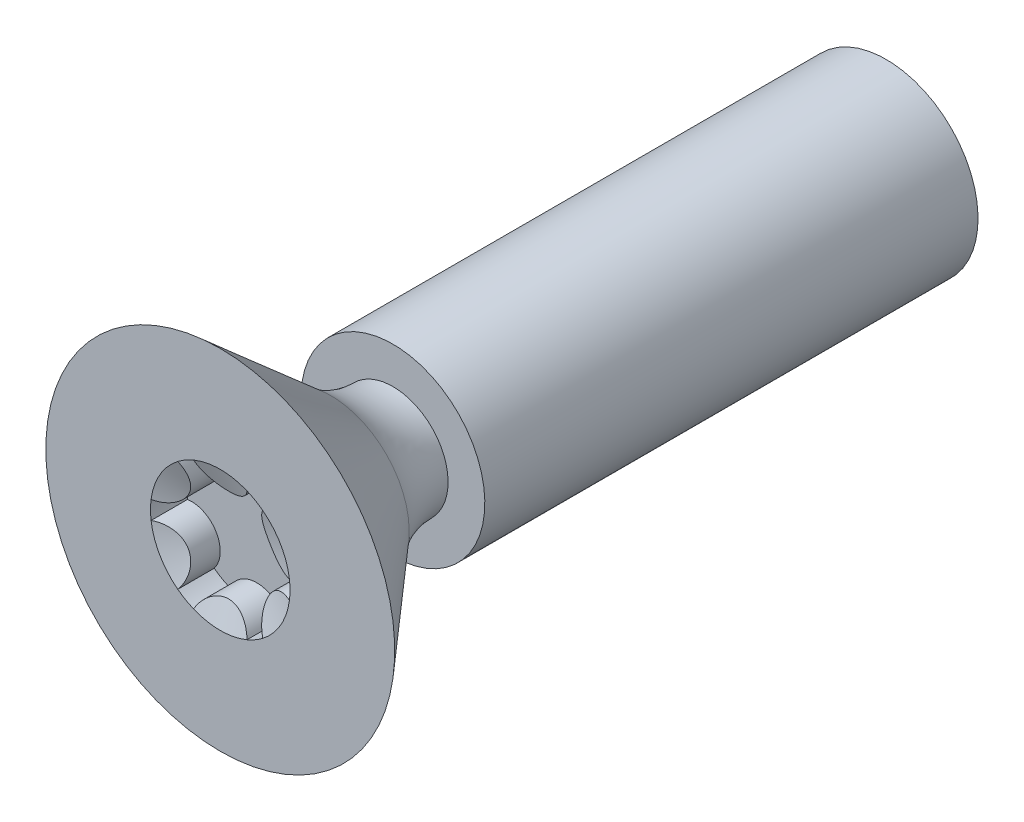
ISO-10303-21;
HEADER;
FILE_DESCRIPTION(('STEP AP214'),'2;1');
FILE_NAME('part.step','',(''),(''),'','','');
FILE_SCHEMA(('AUTOMOTIVE_DESIGN { 1 0 10303 214 1 1 1 1 }'));
ENDSEC;
DATA;
#1=APPLICATION_CONTEXT('core data for automotive mechanical design processes');
#2=APPLICATION_PROTOCOL_DEFINITION('international standard','automotive_design',2000,#1);
#3=PRODUCT_CONTEXT('',#1,'mechanical');
#4=PRODUCT('Part','Part','',(#3));
#5=PRODUCT_RELATED_PRODUCT_CATEGORY('part','',(#4));
#6=PRODUCT_DEFINITION_FORMATION('','',#4);
#7=PRODUCT_DEFINITION_CONTEXT('part definition',#1,'design');
#8=PRODUCT_DEFINITION('design','',#6,#7);
#9=PRODUCT_DEFINITION_SHAPE('','',#8);
#10=(LENGTH_UNIT() NAMED_UNIT(*) SI_UNIT(.MILLI.,.METRE.));
#11=(NAMED_UNIT(*) PLANE_ANGLE_UNIT() SI_UNIT($,.RADIAN.));
#12=(NAMED_UNIT(*) SI_UNIT($,.STERADIAN.) SOLID_ANGLE_UNIT());
#13=UNCERTAINTY_MEASURE_WITH_UNIT(LENGTH_MEASURE(1.E-05),#10,'distance_accuracy_value','');
#14=(GEOMETRIC_REPRESENTATION_CONTEXT(3) GLOBAL_UNCERTAINTY_ASSIGNED_CONTEXT((#13)) GLOBAL_UNIT_ASSIGNED_CONTEXT((#10,
#11,#12)) REPRESENTATION_CONTEXT('',''));
#15=CARTESIAN_POINT('',(0.,0.,0.));
#16=DIRECTION('',(0.,0.,1.));
#17=DIRECTION('',(1.,0.,0.));
#18=AXIS2_PLACEMENT_3D('',#15,#16,#17);
#19=CARTESIAN_POINT('',(0.,0.,-6.35));
#20=DIRECTION('',(0.,0.,1.));
#21=DIRECTION('',(0.,-1.,0.));
#22=AXIS2_PLACEMENT_3D('',#19,#20,#21);
#23=PLANE('',#22);
#24=CARTESIAN_POINT('',(0.,0.,-6.35));
#25=DIRECTION('',(0.,0.,1.));
#26=DIRECTION('',(0.,-1.,0.));
#27=AXIS2_PLACEMENT_3D('',#24,#25,#26);
#28=CIRCLE('',#27,1.75260000000001);
#29=CARTESIAN_POINT('',(0.,-1.75260000000001,-6.35));
#30=VERTEX_POINT('',#29);
#31=EDGE_CURVE('E53',#30,#30,#28,.T.);
#32=ORIENTED_EDGE('',*,*,#31,.F.);
#33=EDGE_LOOP('',(#32));
#34=FACE_BOUND('',#33,.T.);
#35=ADVANCED_FACE('F39',(#34),#23,.F.);
#36=CARTESIAN_POINT('',(0.,0.,6.35));
#37=DIRECTION('',(0.,0.,1.));
#38=DIRECTION('',(0.,-1.,0.));
#39=AXIS2_PLACEMENT_3D('',#36,#37,#38);
#40=CYLINDRICAL_SURFACE('',#39,1.75260000000001);
#41=CARTESIAN_POINT('',(0.,0.,3.05638181183952));
#42=DIRECTION('',(0.,0.,1.));
#43=DIRECTION('',(0.,-1.,0.));
#44=AXIS2_PLACEMENT_3D('',#41,#42,#43);
#45=CIRCLE('',#44,1.7526);
#46=CARTESIAN_POINT('',(0.,-1.75260000000001,3.05638181183952));
#47=VERTEX_POINT('',#46);
#48=EDGE_CURVE('E201',#47,#47,#45,.T.);
#49=ORIENTED_EDGE('',*,*,#48,.F.);
#50=EDGE_LOOP('',(#49));
#51=FACE_BOUND('',#50,.T.);
#52=ORIENTED_EDGE('',*,*,#31,.T.);
#53=EDGE_LOOP('',(#52));
#54=FACE_BOUND('',#53,.T.);
#55=ADVANCED_FACE('F206',(#51,#54),#40,.T.);
#56=CARTESIAN_POINT('',(0.,1.7526,3.05638181183952));
#57=DIRECTION('',(0.,0.,-1.));
#58=DIRECTION('',(0.,1.,0.));
#59=AXIS2_PLACEMENT_3D('',#56,#57,#58);
#60=PLANE('',#59);
#61=CARTESIAN_POINT('',(0.,0.,3.05638181183953));
#62=DIRECTION('',(0.,0.,1.));
#63=DIRECTION('',(0.,-1.,0.));
#64=AXIS2_PLACEMENT_3D('',#61,#62,#63);
#65=CIRCLE('',#64,1.05156000000001);
#66=CARTESIAN_POINT('',(0.,-1.05156000000001,3.05638181183953));
#67=VERTEX_POINT('',#66);
#68=EDGE_CURVE('E198',#67,#67,#65,.T.);
#69=ORIENTED_EDGE('',*,*,#68,.F.);
#70=EDGE_LOOP('',(#69));
#71=FACE_BOUND('',#70,.T.);
#72=ORIENTED_EDGE('',*,*,#48,.T.);
#73=EDGE_LOOP('',(#72));
#74=FACE_BOUND('',#73,.T.);
#75=ADVANCED_FACE('F212',(#71,#74),#60,.F.);
#76=CARTESIAN_POINT('',(0.,0.,3.05638181183952));
#77=DIRECTION('',(0.,0.,1.));
#78=DIRECTION('',(0.,-1.,0.));
#79=AXIS2_PLACEMENT_3D('',#76,#77,#78);
#80=TOROIDAL_SURFACE('',#79,2.85843733234083,1.80687733234082);
#81=CARTESIAN_POINT('',(0.,0.,4.2418));
#82=DIRECTION('',(0.,0.,1.));
#83=DIRECTION('',(0.,-1.,0.));
#84=AXIS2_PLACEMENT_3D('',#81,#82,#83);
#85=CIRCLE('',#84,1.49476969933584);
#86=CARTESIAN_POINT('',(0.,-1.49476969933585,4.2418));
#87=VERTEX_POINT('',#86);
#88=EDGE_CURVE('E195',#87,#87,#85,.T.);
#89=ORIENTED_EDGE('',*,*,#88,.F.);
#90=EDGE_LOOP('',(#89));
#91=FACE_BOUND('',#90,.T.);
#92=ORIENTED_EDGE('',*,*,#68,.T.);
#93=EDGE_LOOP('',(#92));
#94=FACE_BOUND('',#93,.T.);
#95=ADVANCED_FACE('F217',(#91,#94),#80,.F.);
#96=CARTESIAN_POINT('',(0.,0.,4.2418));
#97=DIRECTION('',(0.,0.,1.));
#98=DIRECTION('',(0.,-1.,0.));
#99=AXIS2_PLACEMENT_3D('',#96,#97,#98);
#100=CONICAL_SURFACE('',#99,1.49476969933584,0.715584993317673);
#101=CARTESIAN_POINT('',(0.,0.,6.35));
#102=DIRECTION('',(0.,0.,1.));
#103=DIRECTION('',(0.,-1.,0.));
#104=AXIS2_PLACEMENT_3D('',#101,#102,#103);
#105=CIRCLE('',#104,3.32740000000001);
#106=CARTESIAN_POINT('',(0.,-3.32740000000001,6.35));
#107=VERTEX_POINT('',#106);
#108=EDGE_CURVE('E190',#107,#107,#105,.T.);
#109=ORIENTED_EDGE('',*,*,#108,.F.);
#110=EDGE_LOOP('',(#109));
#111=FACE_BOUND('',#110,.T.);
#112=ORIENTED_EDGE('',*,*,#88,.T.);
#113=EDGE_LOOP('',(#112));
#114=FACE_BOUND('',#113,.T.);
#115=ADVANCED_FACE('F224',(#111,#114),#100,.T.);
#116=CARTESIAN_POINT('',(0.,3.3274,6.35));
#117=DIRECTION('',(0.,0.,-1.));
#118=DIRECTION('',(0.,1.,0.));
#119=AXIS2_PLACEMENT_3D('',#116,#117,#118);
#120=PLANE('',#119);
#121=CARTESIAN_POINT('',(0.,0.,6.35));
#122=DIRECTION('',(0.,0.,1.));
#123=DIRECTION('',(1.,0.,0.));
#124=AXIS2_PLACEMENT_3D('',#121,#122,#123);
#125=CIRCLE('',#124,1.33096);
#126=CARTESIAN_POINT('',(0.810237111553449,1.05592156179402,6.35));
#127=VERTEX_POINT('',#126);
#128=CARTESIAN_POINT('',(0.50933634114064,1.22964670259122,6.35));
#129=VERTEX_POINT('',#128);
#130=EDGE_CURVE('E149',#127,#129,#125,.T.);
#131=ORIENTED_EDGE('',*,*,#130,.F.);
#132=CARTESIAN_POINT('',(0.,0.,6.35));
#133=DIRECTION('',(0.,0.,1.));
#134=DIRECTION('',(1.,0.,0.));
#135=AXIS2_PLACEMENT_3D('',#132,#133,#134);
#136=CIRCLE('',#135,1.33096);
#137=CARTESIAN_POINT('',(1.31957345269409,0.173725140797197,6.35));
#138=VERTEX_POINT('',#137);
#139=EDGE_CURVE('E132',#138,#127,#136,.T.);
#140=ORIENTED_EDGE('',*,*,#139,.F.);
#141=CARTESIAN_POINT('',(0.,0.,6.35));
#142=DIRECTION('',(0.,0.,1.));
#143=DIRECTION('',(0.499999999999998,-0.86602540378444,0.));
#144=AXIS2_PLACEMENT_3D('',#141,#142,#143);
#145=CIRCLE('',#144,1.33096);
#146=CARTESIAN_POINT('',(1.31957345269409,-0.173725140797205,6.35));
#147=VERTEX_POINT('',#146);
#148=EDGE_CURVE('E146',#147,#138,#145,.T.);
#149=ORIENTED_EDGE('',*,*,#148,.F.);
#150=CARTESIAN_POINT('',(0.810237111553442,-1.05592156179403,6.35));
#151=VERTEX_POINT('',#150);
#152=EDGE_CURVE('E154',#151,#147,#136,.T.);
#153=ORIENTED_EDGE('',*,*,#152,.F.);
#154=CARTESIAN_POINT('',(0.,0.,6.35));
#155=DIRECTION('',(0.,0.,1.));
#156=DIRECTION('',(-0.500000000000004,-0.866025403784436,0.));
#157=AXIS2_PLACEMENT_3D('',#154,#155,#156);
#158=CIRCLE('',#157,1.33096);
#159=CARTESIAN_POINT('',(0.509336341140641,-1.22964670259122,6.35));
#160=VERTEX_POINT('',#159);
#161=EDGE_CURVE('E316',#160,#151,#158,.T.);
#162=ORIENTED_EDGE('',*,*,#161,.F.);
#163=CARTESIAN_POINT('',(-0.50933634114064,-1.22964670259122,6.35));
#164=VERTEX_POINT('',#163);
#165=EDGE_CURVE('E317',#164,#160,#136,.T.);
#166=ORIENTED_EDGE('',*,*,#165,.F.);
#167=CARTESIAN_POINT('',(0.,0.,6.35));
#168=DIRECTION('',(0.,0.,1.));
#169=DIRECTION('',(-1.,0.,0.));
#170=AXIS2_PLACEMENT_3D('',#167,#168,#169);
#171=CIRCLE('',#170,1.33096);
#172=CARTESIAN_POINT('',(-0.810237111553456,-1.05592156179402,6.35));
#173=VERTEX_POINT('',#172);
#174=EDGE_CURVE('E351',#173,#164,#171,.T.);
#175=ORIENTED_EDGE('',*,*,#174,.F.);
#176=CARTESIAN_POINT('',(-1.31957345269409,-0.173725140797188,6.35));
#177=VERTEX_POINT('',#176);
#178=EDGE_CURVE('E318',#177,#173,#136,.T.);
#179=ORIENTED_EDGE('',*,*,#178,.F.);
#180=CARTESIAN_POINT('',(0.,0.,6.35));
#181=DIRECTION('',(0.,0.,1.));
#182=DIRECTION('',(-0.499999999999992,0.866025403784443,0.));
#183=AXIS2_PLACEMENT_3D('',#180,#181,#182);
#184=CIRCLE('',#183,1.33096);
#185=CARTESIAN_POINT('',(-1.31957345269409,0.173725140797214,6.35));
#186=VERTEX_POINT('',#185);
#187=EDGE_CURVE('E334',#186,#177,#184,.T.);
#188=ORIENTED_EDGE('',*,*,#187,.F.);
#189=CARTESIAN_POINT('',(-0.810237111553435,1.05592156179403,6.35));
#190=VERTEX_POINT('',#189);
#191=EDGE_CURVE('E321',#190,#186,#136,.T.);
#192=ORIENTED_EDGE('',*,*,#191,.F.);
#193=CARTESIAN_POINT('',(0.,0.,6.35));
#194=DIRECTION('',(0.,0.,1.));
#195=DIRECTION('',(1.,0.,0.));
#196=AXIS2_PLACEMENT_3D('',#193,#194,#195);
#197=CIRCLE('',#196,1.33096);
#198=CARTESIAN_POINT('',(-0.509336341140641,1.22964670259122,6.35));
#199=VERTEX_POINT('',#198);
#200=EDGE_CURVE('E180',#199,#190,#197,.T.);
#201=ORIENTED_EDGE('',*,*,#200,.F.);
#202=EDGE_CURVE('E152',#129,#199,#136,.T.);
#203=ORIENTED_EDGE('',*,*,#202,.F.);
#204=EDGE_LOOP('',(#131,#140,#149,#153,#162,#166,#175,#179,#188,#192,#201,#203));
#205=FACE_BOUND('',#204,.T.);
#206=ORIENTED_EDGE('',*,*,#108,.T.);
#207=EDGE_LOOP('',(#206));
#208=FACE_BOUND('',#207,.T.);
#209=ADVANCED_FACE('F142',(#205,#208),#120,.F.);
#210=CARTESIAN_POINT('',(0.,0.,5.654294));
#211=DIRECTION('',(0.,0.,1.));
#212=DIRECTION('',(1.,0.,0.));
#213=AXIS2_PLACEMENT_3D('',#210,#211,#212);
#214=CYLINDRICAL_SURFACE('',#213,1.33096);
#215=ORIENTED_EDGE('',*,*,#200,.T.);
#216=DIRECTION('',(0.,0.,1.));
#217=VECTOR('',#216,1.);
#218=CARTESIAN_POINT('',(-0.810237111553435,1.05592156179403,5.654294));
#219=LINE('',#218,#217);
#220=CARTESIAN_POINT('',(-0.810237111553435,1.05592156179403,5.654294));
#221=VERTEX_POINT('',#220);
#222=EDGE_CURVE('E345',#221,#190,#219,.T.);
#223=ORIENTED_EDGE('',*,*,#222,.F.);
#224=CARTESIAN_POINT('',(0.,0.,5.654294));
#225=DIRECTION('',(0.,0.,1.));
#226=DIRECTION('',(1.,0.,0.));
#227=AXIS2_PLACEMENT_3D('',#224,#225,#226);
#228=CIRCLE('',#227,1.33096);
#229=CARTESIAN_POINT('',(-0.509336341140641,1.22964670259122,5.654294));
#230=VERTEX_POINT('',#229);
#231=EDGE_CURVE('E183',#230,#221,#228,.T.);
#232=ORIENTED_EDGE('',*,*,#231,.F.);
#233=DIRECTION('',(0.,0.,1.));
#234=VECTOR('',#233,1.);
#235=CARTESIAN_POINT('',(-0.509336341140641,1.22964670259122,5.654294));
#236=LINE('',#235,#234);
#237=EDGE_CURVE('E60',#230,#199,#236,.T.);
#238=ORIENTED_EDGE('',*,*,#237,.T.);
#239=EDGE_LOOP('',(#215,#223,#232,#238));
#240=FACE_BOUND('',#239,.T.);
#241=ADVANCED_FACE('F231',(#240),#214,.F.);
#242=CARTESIAN_POINT('',(0.,1.44062072290116,5.654294));
#243=DIRECTION('',(0.,0.,1.));
#244=DIRECTION('',(1.,0.,0.));
#245=AXIS2_PLACEMENT_3D('',#242,#243,#244);
#246=CYLINDRICAL_SURFACE('',#245,0.551301682976095);
#247=DIRECTION('',(0.,0.,1.));
#248=VECTOR('',#247,1.);
#249=CARTESIAN_POINT('',(0.50933634114064,1.22964670259122,5.654294));
#250=LINE('',#249,#248);
#251=CARTESIAN_POINT('',(0.50933634114064,1.22964670259122,5.654294));
#252=VERTEX_POINT('',#251);
#253=EDGE_CURVE('E185',#252,#129,#250,.T.);
#254=ORIENTED_EDGE('',*,*,#253,.T.);
#255=CARTESIAN_POINT('',(0.509419137856699,1.22984670259123,6.35007878530192));
#256=CARTESIAN_POINT('',(0.497059255405575,1.19993763159311,6.33831981330076));
#257=CARTESIAN_POINT('',(0.482042767501572,1.17113286945755,6.32652402254762));
#258=CARTESIAN_POINT('',(0.447077093721927,1.11641635663131,6.30327240014525));
#259=CARTESIAN_POINT('',(0.427114791397821,1.0905125690331,6.29181756469676));
#260=CARTESIAN_POINT('',(0.382682237911299,1.04242214926884,6.26971605374402));
#261=CARTESIAN_POINT('',(0.358206616074193,1.02024000641709,6.25907036263097));
#262=CARTESIAN_POINT('',(0.305313867818706,0.98039099461675,6.23924325631583));
#263=CARTESIAN_POINT('',(0.276900106441181,0.962720306996337,6.23006060523153));
#264=CARTESIAN_POINT('',(0.218346553525943,0.933397864476356,6.21436216947559));
#265=CARTESIAN_POINT('',(0.188368578891247,0.921485210197658,6.20773430166964));
#266=CARTESIAN_POINT('',(0.126349575651801,0.903022269590593,6.19727952166826));
#267=CARTESIAN_POINT('',(0.0943113114467145,0.896464953231531,6.19344893813857));
#268=CARTESIAN_POINT('',(0.0333823075872127,0.889584944193123,6.18941813736931));
#269=CARTESIAN_POINT('',(0.00459200924303589,0.888591800757138,6.18882771074824));
#270=CARTESIAN_POINT('',(-0.0527204327666539,0.891097177979004,6.19030327626296));
#271=CARTESIAN_POINT('',(-0.0812426229398929,0.894594904578023,6.19236879878385));
#272=CARTESIAN_POINT('',(-0.135347939910202,0.905524068654175,6.19868658235297));
#273=CARTESIAN_POINT('',(-0.161002798409524,0.912692319878048,6.20279205291548));
#274=CARTESIAN_POINT('',(-0.210720230539321,0.93049509433253,6.21272054182784));
#275=CARTESIAN_POINT('',(-0.234782491861755,0.941130295022755,6.21854389583973));
#276=CARTESIAN_POINT('',(-0.282746374423582,0.966508297919056,6.23201734152206));
#277=CARTESIAN_POINT('',(-0.30647777378563,0.981513648404018,6.23977704744072));
#278=CARTESIAN_POINT('',(-0.351181073930154,1.01473117371145,6.25635120950382));
#279=CARTESIAN_POINT('',(-0.372150569602407,1.03294611164975,6.2651665723453));
#280=CARTESIAN_POINT('',(-0.413282804578872,1.07444832048098,6.28454396615723));
#281=CARTESIAN_POINT('',(-0.433058424692213,1.09808049416043,6.29518936217777));
#282=CARTESIAN_POINT('',(-0.46831744783589,1.14813675894561,6.31687704630679));
#283=CARTESIAN_POINT('',(-0.483807870942777,1.17455618464512,6.32791865140363));
#284=CARTESIAN_POINT('',(-0.501396723246258,1.21118933672101,6.34268790020628));
#285=CARTESIAN_POINT('',(-0.505538961042261,1.22046606165091,6.34638459226539));
#286=CARTESIAN_POINT('',(-0.509419137856701,1.22984670259123,6.35007878530192));
#287=B_SPLINE_CURVE_WITH_KNOTS('',3,(#255,#256,#257,#258,#259,#260,#261,#262,#263,#264,#265,
#266,#267,#268,#269,#270,#271,#272,#273,#274,#275,#276,#277,#278,#279,#280,#281,#282,#283,#284,
#285,#286),.UNSPECIFIED.,.F.,.F.,(4,2,2,2,2,2,2,2,2,2,2,2,2,2,2,4),(0.,0.103193645777312,
0.206663949893515,0.310258183640694,0.413764438277474,0.511994444576674,0.610095294697003,
0.696070302877864,0.782030111372833,0.862545377170058,0.943076385501329,1.03011724848073,
1.11723341385086,1.21462841913295,1.31186291257355,1.34428037159392),.UNSPECIFIED.);
#288=EDGE_CURVE('E137',#129,#199,#287,.T.);
#289=ORIENTED_EDGE('',*,*,#288,.T.);
#290=ORIENTED_EDGE('',*,*,#237,.F.);
#291=CARTESIAN_POINT('',(0.,1.44062072290116,5.654294));
#292=DIRECTION('',(0.,0.,-1.));
#293=DIRECTION('',(1.,0.,0.));
#294=AXIS2_PLACEMENT_3D('',#291,#292,#293);
#295=CIRCLE('',#294,0.551301682976095);
#296=EDGE_CURVE('E179',#252,#230,#295,.T.);
#297=ORIENTED_EDGE('',*,*,#296,.F.);
#298=EDGE_LOOP('',(#254,#289,#290,#297));
#299=FACE_BOUND('',#298,.T.);
#300=ADVANCED_FACE('F236',(#299),#246,.T.);
#301=CARTESIAN_POINT('',(0.,0.,5.654294));
#302=DIRECTION('',(0.,0.,1.));
#303=DIRECTION('',(1.,0.,0.));
#304=AXIS2_PLACEMENT_3D('',#301,#302,#303);
#305=CYLINDRICAL_SURFACE('',#304,1.33096);
#306=ORIENTED_EDGE('',*,*,#130,.T.);
#307=ORIENTED_EDGE('',*,*,#253,.F.);
#308=CARTESIAN_POINT('',(0.,0.,5.654294));
#309=DIRECTION('',(0.,0.,1.));
#310=DIRECTION('',(1.,0.,0.));
#311=AXIS2_PLACEMENT_3D('',#308,#309,#310);
#312=CIRCLE('',#311,1.33096);
#313=CARTESIAN_POINT('',(0.810237111553449,1.05592156179402,5.654294));
#314=VERTEX_POINT('',#313);
#315=EDGE_CURVE('E176',#314,#252,#312,.T.);
#316=ORIENTED_EDGE('',*,*,#315,.F.);
#317=DIRECTION('',(0.,0.,1.));
#318=VECTOR('',#317,1.);
#319=CARTESIAN_POINT('',(0.810237111553449,1.05592156179402,5.654294));
#320=LINE('',#319,#318);
#321=EDGE_CURVE('E162',#314,#127,#320,.T.);
#322=ORIENTED_EDGE('',*,*,#321,.T.);
#323=EDGE_LOOP('',(#306,#307,#316,#322));
#324=FACE_BOUND('',#323,.T.);
#325=ADVANCED_FACE('F232',(#324),#305,.F.);
#326=CARTESIAN_POINT('',(0.,0.,5.654294));
#327=DIRECTION('',(0.,0.,1.));
#328=DIRECTION('',(1.,0.,0.));
#329=AXIS2_PLACEMENT_3D('',#326,#327,#328);
#330=PLANE('',#329);
#331=CARTESIAN_POINT('',(1.24761414325071,0.72031036145058,5.654294));
#332=DIRECTION('',(0.,0.,-1.));
#333=DIRECTION('',(0.499999999999998,-0.86602540378444,0.));
#334=AXIS2_PLACEMENT_3D('',#331,#332,#333);
#335=CIRCLE('',#334,0.551301682976095);
#336=CARTESIAN_POINT('',(1.31957345269409,0.173725140797197,5.654294));
#337=VERTEX_POINT('',#336);
#338=EDGE_CURVE('E159',#337,#314,#335,.T.);
#339=ORIENTED_EDGE('',*,*,#338,.T.);
#340=ORIENTED_EDGE('',*,*,#315,.T.);
#341=ORIENTED_EDGE('',*,*,#296,.T.);
#342=ORIENTED_EDGE('',*,*,#231,.T.);
#343=CARTESIAN_POINT('',(-1.2476141432507,0.720310361450596,5.654294));
#344=DIRECTION('',(0.,0.,-1.));
#345=DIRECTION('',(0.50000000000001,0.866025403784433,0.));
#346=AXIS2_PLACEMENT_3D('',#343,#344,#345);
#347=CIRCLE('',#346,0.551301682976095);
#348=CARTESIAN_POINT('',(-1.31957345269409,0.173725140797214,5.654294));
#349=VERTEX_POINT('',#348);
#350=EDGE_CURVE('E248',#221,#349,#347,.T.);
#351=ORIENTED_EDGE('',*,*,#350,.T.);
#352=CARTESIAN_POINT('',(0.,0.,5.654294));
#353=DIRECTION('',(0.,0.,1.));
#354=DIRECTION('',(-0.499999999999992,0.866025403784443,0.));
#355=AXIS2_PLACEMENT_3D('',#352,#353,#354);
#356=CIRCLE('',#355,1.33096);
#357=CARTESIAN_POINT('',(-1.31957345269409,-0.173725140797188,5.654294));
#358=VERTEX_POINT('',#357);
#359=EDGE_CURVE('E339',#349,#358,#356,.T.);
#360=ORIENTED_EDGE('',*,*,#359,.T.);
#361=CARTESIAN_POINT('',(-1.24761414325072,-0.720310361450572,5.654294));
#362=DIRECTION('',(0.,0.,-1.));
#363=DIRECTION('',(-0.499999999999992,0.866025403784443,0.));
#364=AXIS2_PLACEMENT_3D('',#361,#362,#363);
#365=CIRCLE('',#364,0.551301682976095);
#366=CARTESIAN_POINT('',(-0.810237111553456,-1.05592156179402,5.654294));
#367=VERTEX_POINT('',#366);
#368=EDGE_CURVE('E343',#358,#367,#365,.T.);
#369=ORIENTED_EDGE('',*,*,#368,.T.);
#370=CARTESIAN_POINT('',(0.,0.,5.654294));
#371=DIRECTION('',(0.,0.,1.));
#372=DIRECTION('',(-1.,0.,0.));
#373=AXIS2_PLACEMENT_3D('',#370,#371,#372);
#374=CIRCLE('',#373,1.33096);
#375=CARTESIAN_POINT('',(-0.50933634114064,-1.22964670259122,5.654294));
#376=VERTEX_POINT('',#375);
#377=EDGE_CURVE('E354',#367,#376,#374,.T.);
#378=ORIENTED_EDGE('',*,*,#377,.T.);
#379=CARTESIAN_POINT('',(0.,-1.44062072290116,5.654294));
#380=DIRECTION('',(0.,0.,-1.));
#381=DIRECTION('',(-1.,0.,0.));
#382=AXIS2_PLACEMENT_3D('',#379,#380,#381);
#383=CIRCLE('',#382,0.551301682976095);
#384=CARTESIAN_POINT('',(0.509336341140641,-1.22964670259122,5.654294));
#385=VERTEX_POINT('',#384);
#386=EDGE_CURVE('E357',#376,#385,#383,.T.);
#387=ORIENTED_EDGE('',*,*,#386,.T.);
#388=CARTESIAN_POINT('',(0.,0.,5.654294));
#389=DIRECTION('',(0.,0.,1.));
#390=DIRECTION('',(-0.500000000000004,-0.866025403784436,0.));
#391=AXIS2_PLACEMENT_3D('',#388,#389,#390);
#392=CIRCLE('',#391,1.33096);
#393=CARTESIAN_POINT('',(0.810237111553442,-1.05592156179403,5.654294));
#394=VERTEX_POINT('',#393);
#395=EDGE_CURVE('E368',#385,#394,#392,.T.);
#396=ORIENTED_EDGE('',*,*,#395,.T.);
#397=CARTESIAN_POINT('',(1.24761414325071,-0.720310361450588,5.654294));
#398=DIRECTION('',(0.,0.,-1.));
#399=DIRECTION('',(-0.500000000000004,-0.866025403784436,0.));
#400=AXIS2_PLACEMENT_3D('',#397,#398,#399);
#401=CIRCLE('',#400,0.551301682976095);
#402=CARTESIAN_POINT('',(1.31957345269409,-0.173725140797205,5.654294));
#403=VERTEX_POINT('',#402);
#404=EDGE_CURVE('E309',#394,#403,#401,.T.);
#405=ORIENTED_EDGE('',*,*,#404,.T.);
#406=CARTESIAN_POINT('',(0.,0.,5.654294));
#407=DIRECTION('',(0.,0.,1.));
#408=DIRECTION('',(0.499999999999998,-0.86602540378444,0.));
#409=AXIS2_PLACEMENT_3D('',#406,#407,#408);
#410=CIRCLE('',#409,1.33096);
#411=EDGE_CURVE('E168',#403,#337,#410,.T.);
#412=ORIENTED_EDGE('',*,*,#411,.T.);
#413=EDGE_LOOP('',(#339,#340,#341,#342,#351,#360,#369,#378,#387,#396,#405,#412));
#414=FACE_BOUND('',#413,.T.);
#415=ADVANCED_FACE('F235',(#414),#330,.T.);
#416=CARTESIAN_POINT('',(1.24761414325071,0.72031036145058,5.654294));
#417=DIRECTION('',(0.,0.,1.));
#418=DIRECTION('',(1.,0.,0.));
#419=AXIS2_PLACEMENT_3D('',#416,#417,#418);
#420=CYLINDRICAL_SURFACE('',#419,0.551301682976095);
#421=DIRECTION('',(0.,0.,1.));
#422=VECTOR('',#421,1.);
#423=CARTESIAN_POINT('',(1.31957345269409,0.173725140797197,5.654294));
#424=LINE('',#423,#422);
#425=EDGE_CURVE('E156',#337,#138,#424,.T.);
#426=ORIENTED_EDGE('',*,*,#425,.T.);
#427=CARTESIAN_POINT('',(1.31977345269409,0.173751508523532,6.35007342395237));
#428=CARTESIAN_POINT('',(1.28769149198472,0.169501817244821,6.33831449250146));
#429=CARTESIAN_POINT('',(1.255237656133,0.168104956794209,6.3265187650558));
#430=CARTESIAN_POINT('',(1.19036917412597,0.171029552235648,6.30326732424376));
#431=CARTESIAN_POINT('',(1.15795486637479,0.175366350750226,6.29181260736509));
#432=CARTESIAN_POINT('',(1.09409154581573,0.189802484288306,6.26971140555856));
#433=CARTESIAN_POINT('',(1.06264373579766,0.199908715753318,6.25906590520851));
#434=CARTESIAN_POINT('',(1.00168783278603,0.22579220417354,6.23923927518991));
#435=CARTESIAN_POINT('',(0.972178114836382,0.241564636719213,6.23005690932752));
#436=CARTESIAN_POINT('',(0.917508436432027,0.277613561000612,6.21435916886514));
#437=CARTESIAN_POINT('',(0.892203420745523,0.297619447594848,6.20773169671024));
#438=CARTESIAN_POINT('',(0.845205893841437,0.342098910761652,6.1972777667045));
#439=CARTESIAN_POINT('',(0.823508676581428,0.366566578546753,6.19344763748491));
#440=CARTESIAN_POINT('',(0.78708733727333,0.415893122778464,6.18941769068835));
#441=CARTESIAN_POINT('',(0.771832796205303,0.440329806347826,6.18882765936128));
#442=CARTESIAN_POINT('',(0.745347667925498,0.491216619415498,6.19030395097356));
#443=CARTESIAN_POINT('',(0.734116370160226,0.517666392376367,6.19236980455543));
#444=CARTESIAN_POINT('',(0.716529809646883,0.569987626768017,6.19868816773825));
#445=CARTESIAN_POINT('',(0.709910797876567,0.59578963489756,6.20279391448636));
#446=CARTESIAN_POINT('',(0.700470799779711,0.647747744068734,6.21272290102514));
#447=CARTESIAN_POINT('',(0.697650556395293,0.673903913365224,6.21854647650787));
#448=CARTESIAN_POINT('',(0.695647703663518,0.728131058706177,6.23202037484017));
#449=CARTESIAN_POINT('',(0.696777608019332,0.756185884913944,6.23978031789434));
#450=CARTESIAN_POINT('',(0.703194395545627,0.811509062769689,6.25635491004549));
#451=CARTESIAN_POINT('',(0.70848487381178,0.838776713094818,6.26517046569572));
#452=CARTESIAN_POINT('',(0.723862069118206,0.895149371357727,6.28454820938749));
#453=CARTESIAN_POINT('',(0.734441035804263,0.924091567041593,6.29519375619679));
#454=CARTESIAN_POINT('',(0.76016295712813,0.97965463777816,6.31688169736836));
#455=CARTESIAN_POINT('',(0.775298363360485,1.00627925890238,6.32792340898057));
#456=CARTESIAN_POINT('',(0.798234310199934,1.03983399583997,6.3426954625295));
#457=CARTESIAN_POINT('',(0.804201810017325,1.04806540972772,6.34639487100103));
#458=CARTESIAN_POINT('',(0.810390649627402,1.05612156179402,6.35009177099094));
#459=B_SPLINE_CURVE_WITH_KNOTS('',3,(#427,#428,#429,#430,#431,#432,#433,#434,#435,#436,#437,
#438,#439,#440,#441,#442,#443,#444,#445,#446,#447,#448,#449,#450,#451,#452,#453,#454,#455,#456,
#457,#458),.UNSPECIFIED.,.F.,.F.,(4,2,2,2,2,2,2,2,2,2,2,2,2,2,2,4),(0.,0.103193298035698,
0.206663289313431,0.310257222296243,0.413763159878077,0.51199242781885,0.610092542081319,
0.696066752469714,0.782025771276381,0.862541130723361,0.943072234634001,1.03011380307234,
1.11723066570224,1.21462628899542,1.31186144195945,1.34430266093353),.UNSPECIFIED.);
#460=EDGE_CURVE('E129',#138,#127,#459,.T.);
#461=ORIENTED_EDGE('',*,*,#460,.T.);
#462=ORIENTED_EDGE('',*,*,#321,.F.);
#463=ORIENTED_EDGE('',*,*,#338,.F.);
#464=EDGE_LOOP('',(#426,#461,#462,#463));
#465=FACE_BOUND('',#464,.T.);
#466=ADVANCED_FACE('F157',(#465),#420,.T.);
#467=CARTESIAN_POINT('',(0.,0.,5.654294));
#468=DIRECTION('',(0.,0.,1.));
#469=DIRECTION('',(1.,0.,0.));
#470=AXIS2_PLACEMENT_3D('',#467,#468,#469);
#471=CYLINDRICAL_SURFACE('',#470,1.33096);
#472=ORIENTED_EDGE('',*,*,#148,.T.);
#473=ORIENTED_EDGE('',*,*,#425,.F.);
#474=ORIENTED_EDGE('',*,*,#411,.F.);
#475=DIRECTION('',(0.,0.,1.));
#476=VECTOR('',#475,1.);
#477=CARTESIAN_POINT('',(1.31957345269409,-0.173725140797205,5.654294));
#478=LINE('',#477,#476);
#479=EDGE_CURVE('E167',#403,#147,#478,.T.);
#480=ORIENTED_EDGE('',*,*,#479,.T.);
#481=EDGE_LOOP('',(#472,#473,#474,#480));
#482=FACE_BOUND('',#481,.T.);
#483=ADVANCED_FACE('F165',(#482),#471,.F.);
#484=CARTESIAN_POINT('',(1.24761414325071,-0.720310361450588,5.654294));
#485=DIRECTION('',(0.,0.,1.));
#486=DIRECTION('',(0.,-1.,0.));
#487=AXIS2_PLACEMENT_3D('',#484,#485,#486);
#488=CYLINDRICAL_SURFACE('',#487,0.551301682976095);
#489=DIRECTION('',(0.,0.,1.));
#490=VECTOR('',#489,1.);
#491=CARTESIAN_POINT('',(0.810237111553442,-1.05592156179403,5.654294));
#492=LINE('',#491,#490);
#493=EDGE_CURVE('E171',#394,#151,#492,.T.);
#494=ORIENTED_EDGE('',*,*,#493,.T.);
#495=CARTESIAN_POINT('',(0.810390649627397,-1.05612156179403,6.35009177099094));
#496=CARTESIAN_POINT('',(0.790666751535021,-1.03046411908469,6.33833270081678));
#497=CARTESIAN_POINT('',(0.773227457208439,-1.00305798642359,6.32653675677267));
#498=CARTESIAN_POINT('',(0.743320562218244,-0.945420101401159,6.30328469465118));
#499=CARTESIAN_POINT('',(0.730866411561114,-0.915180972897453,6.29182957207925));
#500=CARTESIAN_POINT('',(0.711431175050288,-0.85265699943949,6.26972731247225));
#501=CARTESIAN_POINT('',(0.704456660723348,-0.820369748220385,6.25908115937684));
#502=CARTESIAN_POINT('',(0.696388686375211,-0.754639106309894,6.23925289955387));
#503=CARTESIAN_POINT('',(0.695290239073718,-0.721196720307613,6.23006955769903));
#504=CARTESIAN_POINT('',(0.699169042052126,-0.655825925109581,6.21436943798857));
#505=CARTESIAN_POINT('',(0.703839497972385,-0.62390722024809,6.2077406119213));
#506=CARTESIAN_POINT('',(0.718856098234666,-0.560963976794326,6.19728377317642));
#507=CARTESIAN_POINT('',(0.72919477171191,-0.529938317673692,6.19345208925493));
#508=CARTESIAN_POINT('',(0.753698270537624,-0.473729843889764,6.18941921999458));
#509=CARTESIAN_POINT('',(0.767232226639152,-0.448298835233239,6.18882783588955));
#510=CARTESIAN_POINT('',(0.798056309217824,-0.399914727834203,6.19030164265608));
#511=CARTESIAN_POINT('',(0.815345770300992,-0.376961191214461,6.19236636324212));
#512=CARTESIAN_POINT('',(0.851861797671629,-0.335566841992454,6.19868274268968));
#513=CARTESIAN_POINT('',(0.870896213396081,-0.316932247126781,6.20278754406278));
#514=CARTESIAN_POINT('',(0.911170955502501,-0.282775042004747,6.21271482745936));
#515=CARTESIAN_POINT('',(0.932411712526072,-0.267253041014734,6.21853764522116));
#516=CARTESIAN_POINT('',(0.97836990454507,-0.238402050868651,6.23200999621471));
#517=CARTESIAN_POINT('',(1.00322958268175,-0.225351682381966,6.23976912950599));
#518=CARTESIAN_POINT('',(1.05434651460958,-0.203243969092928,6.25634224982541));
#519=CARTESIAN_POINT('',(1.08060495871074,-0.194190088043533,6.26515714350238));
#520=CARTESIAN_POINT('',(1.13711140294618,-0.179316808812361,6.2845336818413));
#521=CARTESIAN_POINT('',(1.16746456160394,-0.174005113029059,6.29517870657778));
#522=CARTESIAN_POINT('',(1.22844288565316,-0.168494687671887,6.31686576089839));
#523=CARTESIAN_POINT('',(1.25906752049516,-0.168287548463666,6.32790710748641));
#524=CARTESIAN_POINT('',(1.29959276363377,-0.171369765401365,6.34267827470392));
#525=CARTESIAN_POINT('',(1.3097036462868,-0.172421020484483,6.34637709910111));
#526=CARTESIAN_POINT('',(1.31977345269409,-0.173751508523539,6.35007342395237));
#527=B_SPLINE_CURVE_WITH_KNOTS('',3,(#495,#496,#497,#498,#499,#500,#501,#502,#503,#504,#505,
#506,#507,#508,#509,#510,#511,#512,#513,#514,#515,#516,#517,#518,#519,#520,#521,#522,#523,#524,
#525,#526),.UNSPECIFIED.,.F.,.F.,(4,2,2,2,2,2,2,2,2,2,2,2,2,2,2,4),(0.,0.103194487927443,
0.206665549540409,0.310260511588353,0.413767534002547,0.511999328417828,0.610101960833814,
0.696078902290137,0.782040622905937,0.862555658648232,0.943086439239357,1.03012561001324,
1.1172400701653,1.21463350431434,1.31186647437392,1.34430264457852),.UNSPECIFIED.);
#528=EDGE_CURVE('E138',#151,#147,#527,.T.);
#529=ORIENTED_EDGE('',*,*,#528,.T.);
#530=ORIENTED_EDGE('',*,*,#479,.F.);
#531=ORIENTED_EDGE('',*,*,#404,.F.);
#532=EDGE_LOOP('',(#494,#529,#530,#531));
#533=FACE_BOUND('',#532,.T.);
#534=ADVANCED_FACE('F287',(#533),#488,.T.);
#535=CARTESIAN_POINT('',(0.,0.,5.654294));
#536=DIRECTION('',(0.,0.,1.));
#537=DIRECTION('',(0.,-1.,0.));
#538=AXIS2_PLACEMENT_3D('',#535,#536,#537);
#539=CYLINDRICAL_SURFACE('',#538,1.33096);
#540=ORIENTED_EDGE('',*,*,#161,.T.);
#541=ORIENTED_EDGE('',*,*,#493,.F.);
#542=ORIENTED_EDGE('',*,*,#395,.F.);
#543=DIRECTION('',(0.,0.,1.));
#544=VECTOR('',#543,1.);
#545=CARTESIAN_POINT('',(0.509336341140641,-1.22964670259122,5.654294));
#546=LINE('',#545,#544);
#547=EDGE_CURVE('E363',#385,#160,#546,.T.);
#548=ORIENTED_EDGE('',*,*,#547,.T.);
#549=EDGE_LOOP('',(#540,#541,#542,#548));
#550=FACE_BOUND('',#549,.T.);
#551=ADVANCED_FACE('F292',(#550),#539,.F.);
#552=CARTESIAN_POINT('',(0.,-1.44062072290116,5.654294));
#553=DIRECTION('',(0.,0.,1.));
#554=DIRECTION('',(0.,-1.,0.));
#555=AXIS2_PLACEMENT_3D('',#552,#553,#554);
#556=CYLINDRICAL_SURFACE('',#555,0.551301682976095);
#557=DIRECTION('',(0.,0.,1.));
#558=VECTOR('',#557,1.);
#559=CARTESIAN_POINT('',(-0.50933634114064,-1.22964670259122,5.654294));
#560=LINE('',#559,#558);
#561=EDGE_CURVE('E360',#376,#164,#560,.T.);
#562=ORIENTED_EDGE('',*,*,#561,.T.);
#563=CARTESIAN_POINT('',(-0.509419137856699,-1.22984670259123,6.35007878530192));
#564=CARTESIAN_POINT('',(-0.497059255405575,-1.19993763159311,6.33831981330076));
#565=CARTESIAN_POINT('',(-0.482042767501572,-1.17113286945755,6.32652402254762));
#566=CARTESIAN_POINT('',(-0.447077093721927,-1.11641635663131,6.30327240014525));
#567=CARTESIAN_POINT('',(-0.427114791397821,-1.0905125690331,6.29181756469676));
#568=CARTESIAN_POINT('',(-0.382682237911299,-1.04242214926884,6.26971605374402));
#569=CARTESIAN_POINT('',(-0.358206616074193,-1.02024000641709,6.25907036263097));
#570=CARTESIAN_POINT('',(-0.305313867818706,-0.98039099461675,6.23924325631583));
#571=CARTESIAN_POINT('',(-0.276900106441181,-0.962720306996337,6.23006060523153));
#572=CARTESIAN_POINT('',(-0.218346553525943,-0.933397864476356,6.21436216947559));
#573=CARTESIAN_POINT('',(-0.188368578891247,-0.921485210197658,6.20773430166964));
#574=CARTESIAN_POINT('',(-0.126349575651801,-0.903022269590593,6.19727952166826));
#575=CARTESIAN_POINT('',(-0.0943113114467145,-0.896464953231531,6.19344893813857));
#576=CARTESIAN_POINT('',(-0.0333823075872127,-0.889584944193123,6.18941813736931));
#577=CARTESIAN_POINT('',(-0.00459200924303589,-0.888591800757138,6.18882771074824));
#578=CARTESIAN_POINT('',(0.0527204327666539,-0.891097177979004,6.19030327626296));
#579=CARTESIAN_POINT('',(0.0812426229398929,-0.894594904578023,6.19236879878385));
#580=CARTESIAN_POINT('',(0.135347939910202,-0.905524068654175,6.19868658235297));
#581=CARTESIAN_POINT('',(0.161002798409524,-0.912692319878048,6.20279205291548));
#582=CARTESIAN_POINT('',(0.210720230539321,-0.93049509433253,6.21272054182784));
#583=CARTESIAN_POINT('',(0.234782491861755,-0.941130295022755,6.21854389583973));
#584=CARTESIAN_POINT('',(0.282746374423582,-0.966508297919056,6.23201734152206));
#585=CARTESIAN_POINT('',(0.30647777378563,-0.981513648404018,6.23977704744072));
#586=CARTESIAN_POINT('',(0.351181073930154,-1.01473117371145,6.25635120950382));
#587=CARTESIAN_POINT('',(0.372150569602407,-1.03294611164975,6.2651665723453));
#588=CARTESIAN_POINT('',(0.413282804578872,-1.07444832048098,6.28454396615723));
#589=CARTESIAN_POINT('',(0.433058424692213,-1.09808049416043,6.29518936217777));
#590=CARTESIAN_POINT('',(0.46831744783589,-1.14813675894561,6.31687704630679));
#591=CARTESIAN_POINT('',(0.483807870942777,-1.17455618464512,6.32791865140363));
#592=CARTESIAN_POINT('',(0.501396723246258,-1.21118933672101,6.34268790020628));
#593=CARTESIAN_POINT('',(0.505538961042261,-1.22046606165091,6.34638459226539));
#594=CARTESIAN_POINT('',(0.509419137856701,-1.22984670259123,6.35007878530192));
#595=B_SPLINE_CURVE_WITH_KNOTS('',3,(#563,#564,#565,#566,#567,#568,#569,#570,#571,#572,#573,
#574,#575,#576,#577,#578,#579,#580,#581,#582,#583,#584,#585,#586,#587,#588,#589,#590,#591,#592,
#593,#594),.UNSPECIFIED.,.F.,.F.,(4,2,2,2,2,2,2,2,2,2,2,2,2,2,2,4),(0.,0.103193645777312,
0.206663949893515,0.310258183640694,0.413764438277474,0.511994444576674,0.610095294697003,
0.696070302877864,0.782030111372833,0.862545377170058,0.943076385501329,1.03011724848073,
1.11723341385086,1.21462841913295,1.31186291257355,1.34428037159392),.UNSPECIFIED.);
#596=EDGE_CURVE('E275',#164,#160,#595,.T.);
#597=ORIENTED_EDGE('',*,*,#596,.T.);
#598=ORIENTED_EDGE('',*,*,#547,.F.);
#599=ORIENTED_EDGE('',*,*,#386,.F.);
#600=EDGE_LOOP('',(#562,#597,#598,#599));
#601=FACE_BOUND('',#600,.T.);
#602=ADVANCED_FACE('F296',(#601),#556,.T.);
#603=CARTESIAN_POINT('',(0.,0.,5.654294));
#604=DIRECTION('',(0.,0.,1.));
#605=DIRECTION('',(0.,-1.,0.));
#606=AXIS2_PLACEMENT_3D('',#603,#604,#605);
#607=CYLINDRICAL_SURFACE('',#606,1.33096);
#608=ORIENTED_EDGE('',*,*,#174,.T.);
#609=ORIENTED_EDGE('',*,*,#561,.F.);
#610=ORIENTED_EDGE('',*,*,#377,.F.);
#611=DIRECTION('',(0.,0.,1.));
#612=VECTOR('',#611,1.);
#613=CARTESIAN_POINT('',(-0.810237111553456,-1.05592156179402,5.654294));
#614=LINE('',#613,#612);
#615=EDGE_CURVE('E348',#367,#173,#614,.T.);
#616=ORIENTED_EDGE('',*,*,#615,.T.);
#617=EDGE_LOOP('',(#608,#609,#610,#616));
#618=FACE_BOUND('',#617,.T.);
#619=ADVANCED_FACE('F294',(#618),#607,.F.);
#620=CARTESIAN_POINT('',(-1.24761414325072,-0.720310361450572,5.654294));
#621=DIRECTION('',(0.,0.,1.));
#622=DIRECTION('',(0.,-1.,0.));
#623=AXIS2_PLACEMENT_3D('',#620,#621,#622);
#624=CYLINDRICAL_SURFACE('',#623,0.551301682976095);
#625=DIRECTION('',(0.,0.,1.));
#626=VECTOR('',#625,1.);
#627=CARTESIAN_POINT('',(-1.31957345269409,-0.173725140797188,5.654294));
#628=LINE('',#627,#626);
#629=EDGE_CURVE('E352',#358,#177,#628,.T.);
#630=ORIENTED_EDGE('',*,*,#629,.T.);
#631=CARTESIAN_POINT('',(-1.31977345269409,-0.173751508523523,6.35007342395237));
#632=CARTESIAN_POINT('',(-1.28769149198472,-0.169501817244813,6.33831449250146));
#633=CARTESIAN_POINT('',(-1.255237656133,-0.168104956794201,6.3265187650558));
#634=CARTESIAN_POINT('',(-1.19036917412597,-0.171029552235639,6.30326732424376));
#635=CARTESIAN_POINT('',(-1.1579548663748,-0.175366350750218,6.29181260736509));
#636=CARTESIAN_POINT('',(-1.09409154581573,-0.189802484288298,6.26971140555856));
#637=CARTESIAN_POINT('',(-1.06264373579766,-0.19990871575331,6.25906590520851));
#638=CARTESIAN_POINT('',(-1.00168783278603,-0.225792204173533,6.23923927518991));
#639=CARTESIAN_POINT('',(-0.972178114836384,-0.241564636719206,6.23005690932752));
#640=CARTESIAN_POINT('',(-0.917508436432029,-0.277613561000605,6.21435916886514));
#641=CARTESIAN_POINT('',(-0.892203420745526,-0.297619447594842,6.20773169671024));
#642=CARTESIAN_POINT('',(-0.84520589384144,-0.342098910761646,6.1972777667045));
#643=CARTESIAN_POINT('',(-0.823508676581431,-0.366566578546747,6.19344763748491));
#644=CARTESIAN_POINT('',(-0.787087337273333,-0.415893122778458,6.18941769068835));
#645=CARTESIAN_POINT('',(-0.771832796205306,-0.440329806347821,6.18882765936128));
#646=CARTESIAN_POINT('',(-0.745347667925501,-0.491216619415492,6.19030395097356));
#647=CARTESIAN_POINT('',(-0.73411637016023,-0.517666392376362,6.19236980455543));
#648=CARTESIAN_POINT('',(-0.716529809646887,-0.569987626768012,6.19868816773825));
#649=CARTESIAN_POINT('',(-0.709910797876571,-0.595789634897555,6.20279391448636));
#650=CARTESIAN_POINT('',(-0.700470799779715,-0.647747744068729,6.21272290102514));
#651=CARTESIAN_POINT('',(-0.697650556395297,-0.673903913365219,6.21854647650787));
#652=CARTESIAN_POINT('',(-0.695647703663523,-0.728131058706172,6.23202037484017));
#653=CARTESIAN_POINT('',(-0.696777608019337,-0.756185884913939,6.23978031789434));
#654=CARTESIAN_POINT('',(-0.703194395545633,-0.811509062769684,6.25635491004549));
#655=CARTESIAN_POINT('',(-0.708484873811786,-0.838776713094813,6.26517046569572));
#656=CARTESIAN_POINT('',(-0.723862069118212,-0.895149371357723,6.28454820938749));
#657=CARTESIAN_POINT('',(-0.734441035804269,-0.924091567041588,6.29519375619679));
#658=CARTESIAN_POINT('',(-0.760162957128137,-0.979654637778155,6.31688169736836));
#659=CARTESIAN_POINT('',(-0.775298363360492,-1.00627925890237,6.32792340898057));
#660=CARTESIAN_POINT('',(-0.798234310199941,-1.03983399583997,6.3426954625295));
#661=CARTESIAN_POINT('',(-0.804201810017332,-1.04806540972771,6.34639487100103));
#662=CARTESIAN_POINT('',(-0.810390649627409,-1.05612156179402,6.35009177099094));
#663=B_SPLINE_CURVE_WITH_KNOTS('',3,(#631,#632,#633,#634,#635,#636,#637,#638,#639,#640,#641,
#642,#643,#644,#645,#646,#647,#648,#649,#650,#651,#652,#653,#654,#655,#656,#657,#658,#659,#660,
#661,#662),.UNSPECIFIED.,.F.,.F.,(4,2,2,2,2,2,2,2,2,2,2,2,2,2,2,4),(0.,0.103193298035697,
0.206663289313431,0.310257222296243,0.413763159878077,0.511992427818849,0.610092542081319,
0.696066752469713,0.78202577127638,0.86254113072336,0.943072234634001,1.03011380307234,
1.11723066570224,1.21462628899542,1.31186144195945,1.34430266093353),.UNSPECIFIED.);
#664=EDGE_CURVE('E151',#177,#173,#663,.T.);
#665=ORIENTED_EDGE('',*,*,#664,.T.);
#666=ORIENTED_EDGE('',*,*,#615,.F.);
#667=ORIENTED_EDGE('',*,*,#368,.F.);
#668=EDGE_LOOP('',(#630,#665,#666,#667));
#669=FACE_BOUND('',#668,.T.);
#670=ADVANCED_FACE('F380',(#669),#624,.T.);
#671=CARTESIAN_POINT('',(0.,0.,5.654294));
#672=DIRECTION('',(0.,0.,1.));
#673=DIRECTION('',(0.,-1.,0.));
#674=AXIS2_PLACEMENT_3D('',#671,#672,#673);
#675=CYLINDRICAL_SURFACE('',#674,1.33096);
#676=ORIENTED_EDGE('',*,*,#187,.T.);
#677=ORIENTED_EDGE('',*,*,#629,.F.);
#678=ORIENTED_EDGE('',*,*,#359,.F.);
#679=DIRECTION('',(0.,0.,1.));
#680=VECTOR('',#679,1.);
#681=CARTESIAN_POINT('',(-1.31957345269409,0.173725140797214,5.654294));
#682=LINE('',#681,#680);
#683=EDGE_CURVE('E340',#349,#186,#682,.T.);
#684=ORIENTED_EDGE('',*,*,#683,.T.);
#685=EDGE_LOOP('',(#676,#677,#678,#684));
#686=FACE_BOUND('',#685,.T.);
#687=ADVANCED_FACE('F391',(#686),#675,.F.);
#688=CARTESIAN_POINT('',(-1.2476141432507,0.720310361450596,5.654294));
#689=DIRECTION('',(0.,0.,1.));
#690=DIRECTION('',(1.,0.,0.));
#691=AXIS2_PLACEMENT_3D('',#688,#689,#690);
#692=CYLINDRICAL_SURFACE('',#691,0.551301682976095);
#693=ORIENTED_EDGE('',*,*,#222,.T.);
#694=CARTESIAN_POINT('',(-0.810390649627389,1.05612156179403,6.35009177099094));
#695=CARTESIAN_POINT('',(-0.790666751535013,1.0304641190847,6.33833270081678));
#696=CARTESIAN_POINT('',(-0.773227457208431,1.0030579864236,6.32653675677267));
#697=CARTESIAN_POINT('',(-0.743320562218237,0.945420101401164,6.30328469465118));
#698=CARTESIAN_POINT('',(-0.730866411561107,0.915180972897457,6.29182957207925));
#699=CARTESIAN_POINT('',(-0.711431175050282,0.852656999439494,6.26972731247225));
#700=CARTESIAN_POINT('',(-0.704456660723341,0.82036974822039,6.25908115937684));
#701=CARTESIAN_POINT('',(-0.696388686375206,0.754639106309898,6.23925289955387));
#702=CARTESIAN_POINT('',(-0.695290239073712,0.721196720307618,6.23006955769903));
#703=CARTESIAN_POINT('',(-0.699169042052121,0.655825925109586,6.21436943798857));
#704=CARTESIAN_POINT('',(-0.70383949797238,0.623907220248095,6.2077406119213));
#705=CARTESIAN_POINT('',(-0.718856098234662,0.560963976794331,6.19728377317642));
#706=CARTESIAN_POINT('',(-0.729194771711906,0.529938317673697,6.19345208925493));
#707=CARTESIAN_POINT('',(-0.75369827053762,0.473729843889769,6.18941921999458));
#708=CARTESIAN_POINT('',(-0.767232226639148,0.448298835233244,6.18882783588955));
#709=CARTESIAN_POINT('',(-0.798056309217821,0.399914727834208,6.19030164265608));
#710=CARTESIAN_POINT('',(-0.815345770300989,0.376961191214466,6.19236636324212));
#711=CARTESIAN_POINT('',(-0.851861797671626,0.33556684199246,6.19868274268968));
#712=CARTESIAN_POINT('',(-0.870896213396079,0.316932247126787,6.20278754406278));
#713=CARTESIAN_POINT('',(-0.911170955502499,0.282775042004753,6.21271482745936));
#714=CARTESIAN_POINT('',(-0.93241171252607,0.26725304101474,6.21853764522116));
#715=CARTESIAN_POINT('',(-0.978369904545068,0.238402050868658,6.23200999621471));
#716=CARTESIAN_POINT('',(-1.00322958268175,0.225351682381973,6.23976912950599));
#717=CARTESIAN_POINT('',(-1.05434651460958,0.203243969092936,6.25634224982541));
#718=CARTESIAN_POINT('',(-1.08060495871074,0.194190088043541,6.26515714350238));
#719=CARTESIAN_POINT('',(-1.13711140294617,0.179316808812369,6.2845336818413));
#720=CARTESIAN_POINT('',(-1.16746456160394,0.174005113029067,6.29517870657778));
#721=CARTESIAN_POINT('',(-1.22844288565316,0.168494687671895,6.31686576089839));
#722=CARTESIAN_POINT('',(-1.25906752049516,0.168287548463675,6.32790710748641));
#723=CARTESIAN_POINT('',(-1.29959276363377,0.171369765401374,6.34267827470392));
#724=CARTESIAN_POINT('',(-1.3097036462868,0.172421020484492,6.34637709910111));
#725=CARTESIAN_POINT('',(-1.31977345269409,0.173751508523548,6.35007342395237));
#726=B_SPLINE_CURVE_WITH_KNOTS('',3,(#694,#695,#696,#697,#698,#699,#700,#701,#702,#703,#704,
#705,#706,#707,#708,#709,#710,#711,#712,#713,#714,#715,#716,#717,#718,#719,#720,#721,#722,#723,
#724,#725),.UNSPECIFIED.,.F.,.F.,(4,2,2,2,2,2,2,2,2,2,2,2,2,2,2,4),(0.,0.103194487927443,
0.206665549540409,0.310260511588353,0.413767534002547,0.511999328417827,0.610101960833814,
0.696078902290138,0.782040622905937,0.862555658648233,0.943086439239357,1.03012561001324,
1.1172400701653,1.21463350431434,1.31186647437393,1.34430264457852),.UNSPECIFIED.);
#727=EDGE_CURVE('E11',#190,#186,#726,.T.);
#728=ORIENTED_EDGE('',*,*,#727,.T.);
#729=ORIENTED_EDGE('',*,*,#683,.F.);
#730=ORIENTED_EDGE('',*,*,#350,.F.);
#731=EDGE_LOOP('',(#693,#728,#729,#730));
#732=FACE_BOUND('',#731,.T.);
#733=ADVANCED_FACE('F261',(#732),#692,.T.);
#734=CARTESIAN_POINT('',(0.,0.,6.35));
#735=DIRECTION('',(0.,0.,1.));
#736=DIRECTION('',(1.,0.,0.));
#737=AXIS2_PLACEMENT_3D('',#734,#735,#736);
#738=CONICAL_SURFACE('',#737,1.33096,1.22173047639603);
#739=ORIENTED_EDGE('',*,*,#191,.T.);
#740=ORIENTED_EDGE('',*,*,#727,.F.);
#741=EDGE_LOOP('',(#739,#740));
#742=FACE_BOUND('',#741,.T.);
#743=ADVANCED_FACE('F260',(#742),#738,.F.);
#744=ORIENTED_EDGE('',*,*,#178,.T.);
#745=ORIENTED_EDGE('',*,*,#664,.F.);
#746=EDGE_LOOP('',(#744,#745));
#747=FACE_BOUND('',#746,.T.);
#748=ADVANCED_FACE('F381',(#747),#738,.F.);
#749=ORIENTED_EDGE('',*,*,#165,.T.);
#750=ORIENTED_EDGE('',*,*,#596,.F.);
#751=EDGE_LOOP('',(#749,#750));
#752=FACE_BOUND('',#751,.T.);
#753=ADVANCED_FACE('F383',(#752),#738,.F.);
#754=ORIENTED_EDGE('',*,*,#152,.T.);
#755=ORIENTED_EDGE('',*,*,#528,.F.);
#756=EDGE_LOOP('',(#754,#755));
#757=FACE_BOUND('',#756,.T.);
#758=ADVANCED_FACE('F313',(#757),#738,.F.);
#759=ORIENTED_EDGE('',*,*,#139,.T.);
#760=ORIENTED_EDGE('',*,*,#460,.F.);
#761=EDGE_LOOP('',(#759,#760));
#762=FACE_BOUND('',#761,.T.);
#763=ADVANCED_FACE('F131',(#762),#738,.F.);
#764=ORIENTED_EDGE('',*,*,#202,.T.);
#765=ORIENTED_EDGE('',*,*,#288,.F.);
#766=EDGE_LOOP('',(#764,#765));
#767=FACE_BOUND('',#766,.T.);
#768=ADVANCED_FACE('F256',(#767),#738,.F.);
#769=CLOSED_SHELL('',(#35,#55,#75,#95,#115,#209,#241,#300,#325,#415,#466,#483,#534,#551,#602,
#619,#670,#687,#733,#743,#748,#753,#758,#763,#768));
#770=MANIFOLD_SOLID_BREP('B2',#769);
#771=ADVANCED_BREP_SHAPE_REPRESENTATION('',(#18,#770),#14);
#772=SHAPE_DEFINITION_REPRESENTATION(#9,#771);
ENDSEC;
END-ISO-10303-21;
